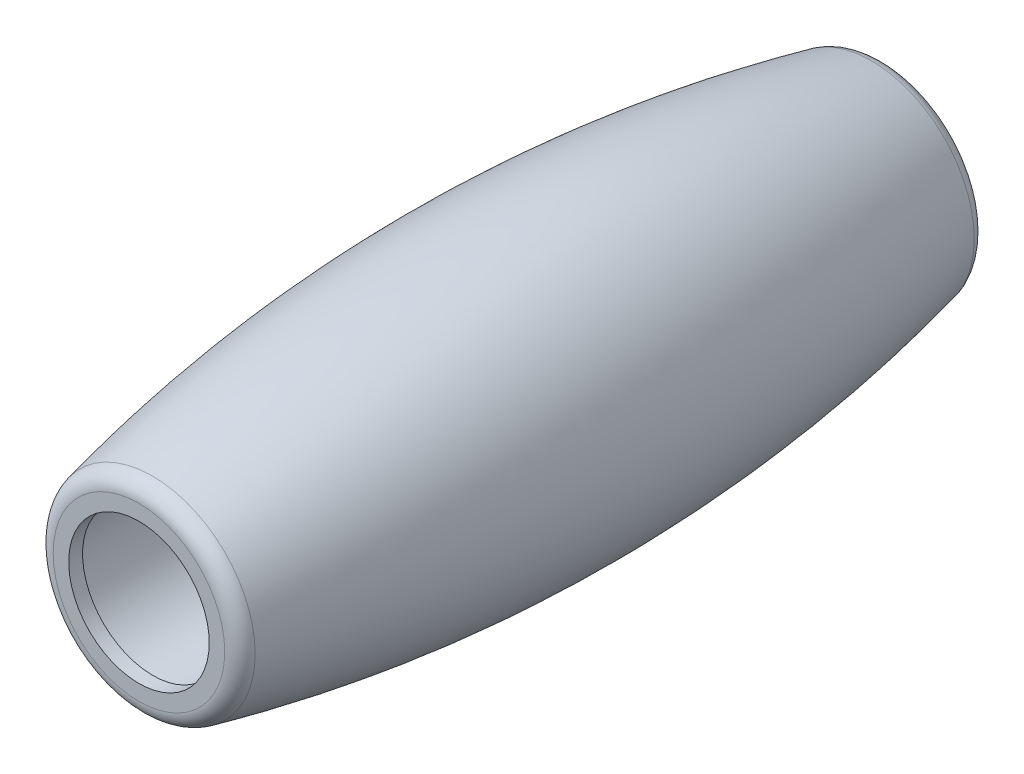
ISO-10303-21;
HEADER;
FILE_DESCRIPTION(('STEP AP214'),'2;1');
FILE_NAME('part.step','',(''),(''),'','','');
FILE_SCHEMA(('AUTOMOTIVE_DESIGN { 1 0 10303 214 1 1 1 1 }'));
ENDSEC;
DATA;
#1=APPLICATION_CONTEXT('core data for automotive mechanical design processes');
#2=APPLICATION_PROTOCOL_DEFINITION('international standard','automotive_design',2000,#1);
#3=PRODUCT_CONTEXT('',#1,'mechanical');
#4=PRODUCT('Part','Part','',(#3));
#5=PRODUCT_RELATED_PRODUCT_CATEGORY('part','',(#4));
#6=PRODUCT_DEFINITION_FORMATION('','',#4);
#7=PRODUCT_DEFINITION_CONTEXT('part definition',#1,'design');
#8=PRODUCT_DEFINITION('design','',#6,#7);
#9=PRODUCT_DEFINITION_SHAPE('','',#8);
#10=(LENGTH_UNIT() NAMED_UNIT(*) SI_UNIT(.MILLI.,.METRE.));
#11=(NAMED_UNIT(*) PLANE_ANGLE_UNIT() SI_UNIT($,.RADIAN.));
#12=(NAMED_UNIT(*) SI_UNIT($,.STERADIAN.) SOLID_ANGLE_UNIT());
#13=UNCERTAINTY_MEASURE_WITH_UNIT(LENGTH_MEASURE(1.E-05),#10,'distance_accuracy_value','');
#14=(GEOMETRIC_REPRESENTATION_CONTEXT(3) GLOBAL_UNCERTAINTY_ASSIGNED_CONTEXT((#13)) GLOBAL_UNIT_ASSIGNED_CONTEXT((#10,
#11,#12)) REPRESENTATION_CONTEXT('',''));
#15=CARTESIAN_POINT('',(0.,0.,0.));
#16=DIRECTION('',(0.,0.,1.));
#17=DIRECTION('',(1.,0.,0.));
#18=AXIS2_PLACEMENT_3D('',#15,#16,#17);
#19=CARTESIAN_POINT('',(0.,0.,21.5));
#20=DIRECTION('',(0.,0.,1.));
#21=DIRECTION('',(1.,0.,0.));
#22=AXIS2_PLACEMENT_3D('',#19,#20,#21);
#23=CYLINDRICAL_SURFACE('',#22,4.5);
#24=CARTESIAN_POINT('',(0.,0.,-20.7));
#25=DIRECTION('',(0.,0.,1.));
#26=DIRECTION('',(1.,0.,0.));
#27=AXIS2_PLACEMENT_3D('',#24,#25,#26);
#28=CIRCLE('',#27,4.5);
#29=CARTESIAN_POINT('',(4.5,0.,-20.7));
#30=VERTEX_POINT('',#29);
#31=EDGE_CURVE('E241',#30,#30,#28,.F.);
#32=ORIENTED_EDGE('',*,*,#31,.T.);
#33=EDGE_LOOP('',(#32));
#34=FACE_BOUND('',#33,.T.);
#35=CARTESIAN_POINT('',(0.,0.,20.7));
#36=DIRECTION('',(0.,0.,1.));
#37=DIRECTION('',(1.,0.,0.));
#38=AXIS2_PLACEMENT_3D('',#35,#36,#37);
#39=CIRCLE('',#38,4.5);
#40=CARTESIAN_POINT('',(4.5,0.,20.7));
#41=VERTEX_POINT('',#40);
#42=EDGE_CURVE('E238',#41,#41,#39,.T.);
#43=ORIENTED_EDGE('',*,*,#42,.T.);
#44=EDGE_LOOP('',(#43));
#45=FACE_BOUND('',#44,.T.);
#46=ADVANCED_FACE('F17',(#34,#45),#23,.F.);
#47=CARTESIAN_POINT('',(0.,4.5,-20.7));
#48=DIRECTION('',(0.,0.,-1.));
#49=DIRECTION('',(-1.,0.,0.));
#50=AXIS2_PLACEMENT_3D('',#47,#48,#49);
#51=PLANE('',#50);
#52=ORIENTED_EDGE('',*,*,#31,.F.);
#53=EDGE_LOOP('',(#52));
#54=FACE_BOUND('',#53,.T.);
#55=CARTESIAN_POINT('',(0.,0.,-20.7));
#56=DIRECTION('',(0.,0.,1.));
#57=DIRECTION('',(1.,0.,0.));
#58=AXIS2_PLACEMENT_3D('',#55,#56,#57);
#59=CIRCLE('',#58,4.05);
#60=CARTESIAN_POINT('',(4.05,0.,-20.7));
#61=VERTEX_POINT('',#60);
#62=EDGE_CURVE('E233',#61,#61,#59,.F.);
#63=ORIENTED_EDGE('',*,*,#62,.T.);
#64=EDGE_LOOP('',(#63));
#65=FACE_BOUND('',#64,.T.);
#66=ADVANCED_FACE('F136',(#54,#65),#51,.F.);
#67=CARTESIAN_POINT('',(0.,4.49999999999999,20.7));
#68=DIRECTION('',(0.,0.,1.));
#69=DIRECTION('',(1.,0.,0.));
#70=AXIS2_PLACEMENT_3D('',#67,#68,#69);
#71=PLANE('',#70);
#72=CARTESIAN_POINT('',(0.,0.,20.7));
#73=DIRECTION('',(0.,0.,1.));
#74=DIRECTION('',(1.,0.,0.));
#75=AXIS2_PLACEMENT_3D('',#72,#73,#74);
#76=CIRCLE('',#75,4.05);
#77=CARTESIAN_POINT('',(4.05,0.,20.7));
#78=VERTEX_POINT('',#77);
#79=EDGE_CURVE('E230',#78,#78,#76,.T.);
#80=ORIENTED_EDGE('',*,*,#79,.T.);
#81=EDGE_LOOP('',(#80));
#82=FACE_BOUND('',#81,.T.);
#83=ORIENTED_EDGE('',*,*,#42,.F.);
#84=EDGE_LOOP('',(#83));
#85=FACE_BOUND('',#84,.T.);
#86=ADVANCED_FACE('F133',(#82,#85),#71,.F.);
#87=CARTESIAN_POINT('',(0.,0.,21.5));
#88=DIRECTION('',(0.,0.,1.));
#89=DIRECTION('',(1.,0.,0.));
#90=AXIS2_PLACEMENT_3D('',#87,#88,#89);
#91=CYLINDRICAL_SURFACE('',#90,4.05);
#92=CARTESIAN_POINT('',(0.,0.,-21.5));
#93=DIRECTION('',(0.,0.,1.));
#94=DIRECTION('',(1.,0.,0.));
#95=AXIS2_PLACEMENT_3D('',#92,#93,#94);
#96=CIRCLE('',#95,4.05);
#97=CARTESIAN_POINT('',(4.05,0.,-21.5));
#98=VERTEX_POINT('',#97);
#99=EDGE_CURVE('E228',#98,#98,#96,.F.);
#100=ORIENTED_EDGE('',*,*,#99,.T.);
#101=EDGE_LOOP('',(#100));
#102=FACE_BOUND('',#101,.T.);
#103=ORIENTED_EDGE('',*,*,#62,.F.);
#104=EDGE_LOOP('',(#103));
#105=FACE_BOUND('',#104,.T.);
#106=ADVANCED_FACE('F129',(#102,#105),#91,.F.);
#107=CARTESIAN_POINT('',(0.,0.,21.5));
#108=DIRECTION('',(0.,0.,1.));
#109=DIRECTION('',(1.,0.,0.));
#110=AXIS2_PLACEMENT_3D('',#107,#108,#109);
#111=CYLINDRICAL_SURFACE('',#110,4.05);
#112=ORIENTED_EDGE('',*,*,#79,.F.);
#113=EDGE_LOOP('',(#112));
#114=FACE_BOUND('',#113,.T.);
#115=CARTESIAN_POINT('',(0.,0.,21.5));
#116=DIRECTION('',(0.,0.,1.));
#117=DIRECTION('',(1.,0.,0.));
#118=AXIS2_PLACEMENT_3D('',#115,#116,#117);
#119=CIRCLE('',#118,4.05);
#120=CARTESIAN_POINT('',(4.05,0.,21.5));
#121=VERTEX_POINT('',#120);
#122=EDGE_CURVE('E52',#121,#121,#119,.T.);
#123=ORIENTED_EDGE('',*,*,#122,.T.);
#124=EDGE_LOOP('',(#123));
#125=FACE_BOUND('',#124,.T.);
#126=ADVANCED_FACE('F124',(#114,#125),#111,.F.);
#127=CARTESIAN_POINT('',(0.,5.7385080956851,-21.5));
#128=DIRECTION('',(0.,0.,1.));
#129=DIRECTION('',(1.,0.,0.));
#130=AXIS2_PLACEMENT_3D('',#127,#128,#129);
#131=PLANE('',#130);
#132=ORIENTED_EDGE('',*,*,#99,.F.);
#133=EDGE_LOOP('',(#132));
#134=FACE_BOUND('',#133,.T.);
#135=CARTESIAN_POINT('',(0.,0.,-21.5));
#136=DIRECTION('',(0.,0.,1.));
#137=DIRECTION('',(1.,0.,0.));
#138=AXIS2_PLACEMENT_3D('',#135,#136,#137);
#139=CIRCLE('',#138,4.94422376921233);
#140=CARTESIAN_POINT('',(4.94422376921233,0.,-21.5));
#141=VERTEX_POINT('',#140);
#142=CARTESIAN_POINT('',(-4.94422376921233,0.,-21.5));
#143=VERTEX_POINT('',#142);
#144=EDGE_CURVE('E45',#141,#143,#139,.T.);
#145=ORIENTED_EDGE('',*,*,#144,.F.);
#146=CARTESIAN_POINT('',(0.,0.,-21.5));
#147=DIRECTION('',(0.,0.,1.));
#148=DIRECTION('',(-1.,0.,0.));
#149=AXIS2_PLACEMENT_3D('',#146,#147,#148);
#150=CIRCLE('',#149,4.94422376921233);
#151=EDGE_CURVE('E48',#143,#141,#150,.T.);
#152=ORIENTED_EDGE('',*,*,#151,.F.);
#153=EDGE_LOOP('',(#145,#152));
#154=FACE_BOUND('',#153,.T.);
#155=ADVANCED_FACE('F50',(#134,#154),#131,.F.);
#156=CARTESIAN_POINT('',(0.,4.05,21.5));
#157=DIRECTION('',(0.,0.,-1.));
#158=DIRECTION('',(-1.,0.,0.));
#159=AXIS2_PLACEMENT_3D('',#156,#157,#158);
#160=PLANE('',#159);
#161=ORIENTED_EDGE('',*,*,#122,.F.);
#162=EDGE_LOOP('',(#161));
#163=FACE_BOUND('',#162,.T.);
#164=CARTESIAN_POINT('',(0.,0.,21.5));
#165=DIRECTION('',(0.,0.,-1.));
#166=DIRECTION('',(-1.,0.,0.));
#167=AXIS2_PLACEMENT_3D('',#164,#165,#166);
#168=CIRCLE('',#167,4.94422376921233);
#169=CARTESIAN_POINT('',(-4.94422376921233,0.,21.5));
#170=VERTEX_POINT('',#169);
#171=CARTESIAN_POINT('',(4.94422376921233,0.,21.5));
#172=VERTEX_POINT('',#171);
#173=EDGE_CURVE('E57',#170,#172,#168,.T.);
#174=ORIENTED_EDGE('',*,*,#173,.F.);
#175=CARTESIAN_POINT('',(0.,0.,21.5));
#176=DIRECTION('',(0.,0.,-1.));
#177=DIRECTION('',(1.,0.,0.));
#178=AXIS2_PLACEMENT_3D('',#175,#176,#177);
#179=CIRCLE('',#178,4.94422376921233);
#180=EDGE_CURVE('E36',#172,#170,#179,.T.);
#181=ORIENTED_EDGE('',*,*,#180,.F.);
#182=EDGE_LOOP('',(#174,#181));
#183=FACE_BOUND('',#182,.T.);
#184=ADVANCED_FACE('F77',(#163,#183),#160,.F.);
#185=CARTESIAN_POINT('',(0.,0.,-20.5));
#186=DIRECTION('',(0.,0.,1.));
#187=DIRECTION('',(1.,0.,0.));
#188=AXIS2_PLACEMENT_3D('',#185,#186,#187);
#189=TOROIDAL_SURFACE('',#188,4.94422376921233,1.);
#190=CARTESIAN_POINT('',(0.,0.,-20.7221434308234));
#191=DIRECTION('',(0.,0.,1.));
#192=DIRECTION('',(1.,0.,0.));
#193=AXIS2_PLACEMENT_3D('',#190,#191,#192);
#194=CIRCLE('',#193,5.91923776713339);
#195=CARTESIAN_POINT('',(5.91923776713339,0.,-20.7221434308234));
#196=VERTEX_POINT('',#195);
#197=EDGE_CURVE('E28',#196,#196,#194,.T.);
#198=ORIENTED_EDGE('',*,*,#197,.F.);
#199=EDGE_LOOP('',(#198));
#200=FACE_BOUND('',#199,.T.);
#201=ORIENTED_EDGE('',*,*,#144,.T.);
#202=ORIENTED_EDGE('',*,*,#151,.T.);
#203=EDGE_LOOP('',(#201,#202));
#204=FACE_BOUND('',#203,.T.);
#205=ADVANCED_FACE('F56',(#200,#204),#189,.T.);
#206=CARTESIAN_POINT('',(0.,0.,20.5));
#207=DIRECTION('',(0.,0.,-1.));
#208=DIRECTION('',(-1.,0.,0.));
#209=AXIS2_PLACEMENT_3D('',#206,#207,#208);
#210=TOROIDAL_SURFACE('',#209,4.94422376921233,1.);
#211=CARTESIAN_POINT('',(0.,0.,20.7221434308233));
#212=DIRECTION('',(0.,0.,1.));
#213=DIRECTION('',(1.,0.,0.));
#214=AXIS2_PLACEMENT_3D('',#211,#212,#213);
#215=CIRCLE('',#214,5.91923776713341);
#216=CARTESIAN_POINT('',(5.91923776713341,0.,20.7221434308233));
#217=VERTEX_POINT('',#216);
#218=EDGE_CURVE('E11',#217,#217,#215,.F.);
#219=ORIENTED_EDGE('',*,*,#218,.F.);
#220=EDGE_LOOP('',(#219));
#221=FACE_BOUND('',#220,.T.);
#222=ORIENTED_EDGE('',*,*,#173,.T.);
#223=ORIENTED_EDGE('',*,*,#180,.T.);
#224=EDGE_LOOP('',(#222,#223));
#225=FACE_BOUND('',#224,.T.);
#226=ADVANCED_FACE('F76',(#221,#225),#210,.T.);
#227=CARTESIAN_POINT('',(-85.0327198806462,0.,0.));
#228=DIRECTION('',(0.,1.,0.));
#229=DIRECTION('',(1.,0.,0.));
#230=AXIS2_PLACEMENT_3D('',#227,#228,#229);
#231=CIRCLE('',#230,93.2827198806462);
#232=TRIMMED_CURVE('',#231,(PARAMETER_VALUE(-0.423735990149599)),
(PARAMETER_VALUE(0.423735990149599)),.T.,.PARAMETER.);
#233=CARTESIAN_POINT('',(0.,0.,0.));
#234=DIRECTION('',(0.,0.,1.));
#235=AXIS1_PLACEMENT('',#233,#234);
#236=SURFACE_OF_REVOLUTION('',#232,#235);
#237=ORIENTED_EDGE('',*,*,#218,.T.);
#238=EDGE_LOOP('',(#237));
#239=FACE_BOUND('',#238,.T.);
#240=ORIENTED_EDGE('',*,*,#197,.T.);
#241=EDGE_LOOP('',(#240));
#242=FACE_BOUND('',#241,.T.);
#243=ADVANCED_FACE('F147',(#239,#242),#236,.F.);
#244=CLOSED_SHELL('',(#46,#66,#86,#106,#126,#155,#184,#205,#226,#243));
#245=MANIFOLD_SOLID_BREP('B1',#244);
#246=ADVANCED_BREP_SHAPE_REPRESENTATION('',(#18,#245),#14);
#247=SHAPE_DEFINITION_REPRESENTATION(#9,#246);
ENDSEC;
END-ISO-10303-21;
